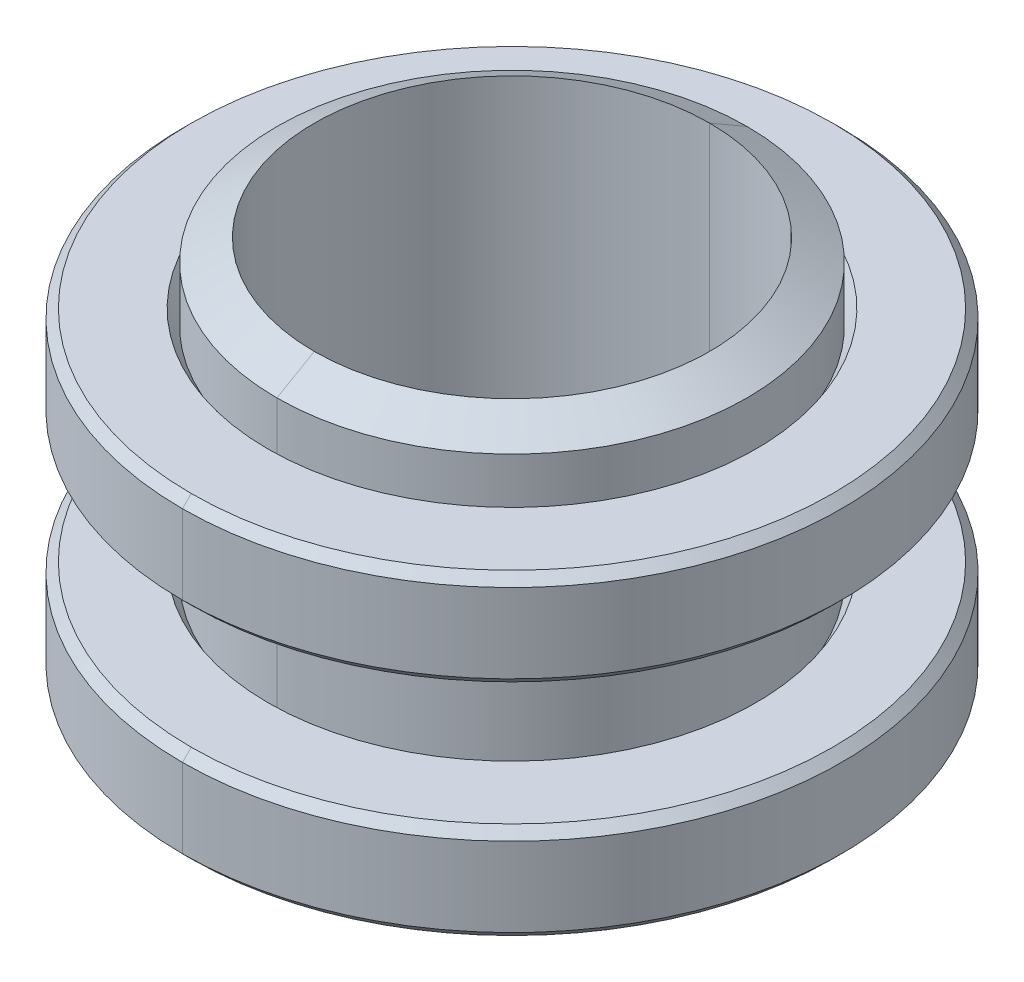
ISO-10303-21;
HEADER;
FILE_DESCRIPTION(('STEP AP214'),'2;1');
FILE_NAME('part.step','',(''),(''),'','','');
FILE_SCHEMA(('AUTOMOTIVE_DESIGN { 1 0 10303 214 1 1 1 1 }'));
ENDSEC;
DATA;
#1=APPLICATION_CONTEXT('core data for automotive mechanical design processes');
#2=APPLICATION_PROTOCOL_DEFINITION('international standard','automotive_design',2000,#1);
#3=PRODUCT_CONTEXT('',#1,'mechanical');
#4=PRODUCT('Part','Part','',(#3));
#5=PRODUCT_RELATED_PRODUCT_CATEGORY('part','',(#4));
#6=PRODUCT_DEFINITION_FORMATION('','',#4);
#7=PRODUCT_DEFINITION_CONTEXT('part definition',#1,'design');
#8=PRODUCT_DEFINITION('design','',#6,#7);
#9=PRODUCT_DEFINITION_SHAPE('','',#8);
#10=(LENGTH_UNIT() NAMED_UNIT(*) SI_UNIT(.MILLI.,.METRE.));
#11=(NAMED_UNIT(*) PLANE_ANGLE_UNIT() SI_UNIT($,.RADIAN.));
#12=(NAMED_UNIT(*) SI_UNIT($,.STERADIAN.) SOLID_ANGLE_UNIT());
#13=UNCERTAINTY_MEASURE_WITH_UNIT(LENGTH_MEASURE(1.E-05),#10,'distance_accuracy_value','');
#14=(GEOMETRIC_REPRESENTATION_CONTEXT(3) GLOBAL_UNCERTAINTY_ASSIGNED_CONTEXT((#13)) GLOBAL_UNIT_ASSIGNED_CONTEXT((#10,
#11,#12)) REPRESENTATION_CONTEXT('',''));
#15=CARTESIAN_POINT('',(0.,0.,0.));
#16=DIRECTION('',(0.,0.,1.));
#17=DIRECTION('',(1.,0.,0.));
#18=AXIS2_PLACEMENT_3D('',#15,#16,#17);
#19=CARTESIAN_POINT('',(0.,6.35,0.));
#20=DIRECTION('',(0.,1.,0.));
#21=DIRECTION('',(0.,0.,1.));
#22=AXIS2_PLACEMENT_3D('',#19,#20,#21);
#23=CYLINDRICAL_SURFACE('',#22,6.7945);
#24=DIRECTION('',(0.,1.,0.));
#25=VECTOR('',#24,1.);
#26=CARTESIAN_POINT('',(0.,6.35,-6.7945));
#27=LINE('',#26,#25);
#28=CARTESIAN_POINT('',(0.,-5.7267503844098,-6.7945));
#29=VERTEX_POINT('',#28);
#30=CARTESIAN_POINT('',(0.,5.7267503844098,-6.7945));
#31=VERTEX_POINT('',#30);
#32=EDGE_CURVE('P0_E81',#29,#31,#27,.T.);
#33=ORIENTED_EDGE('',*,*,#32,.F.);
#34=CARTESIAN_POINT('',(0.,-5.7267503844098,0.));
#35=DIRECTION('',(0.,1.,0.));
#36=DIRECTION('',(0.,0.,1.));
#37=AXIS2_PLACEMENT_3D('',#34,#35,#36);
#38=CIRCLE('',#37,6.7945);
#39=CARTESIAN_POINT('',(0.,-5.7267503844098,6.7945));
#40=VERTEX_POINT('',#39);
#41=EDGE_CURVE('P0_E11',#29,#40,#38,.T.);
#42=ORIENTED_EDGE('',*,*,#41,.T.);
#43=DIRECTION('',(0.,1.,0.));
#44=VECTOR('',#43,1.);
#45=CARTESIAN_POINT('',(0.,6.35,6.7945));
#46=LINE('',#45,#44);
#47=CARTESIAN_POINT('',(0.,5.7267503844098,6.7945));
#48=VERTEX_POINT('',#47);
#49=EDGE_CURVE('P0_E78',#40,#48,#46,.T.);
#50=ORIENTED_EDGE('',*,*,#49,.T.);
#51=CARTESIAN_POINT('',(0.,5.7267503844098,0.));
#52=DIRECTION('',(0.,1.,0.));
#53=DIRECTION('',(0.,0.,1.));
#54=AXIS2_PLACEMENT_3D('',#51,#52,#53);
#55=CIRCLE('',#54,6.7945);
#56=EDGE_CURVE('P0_E25',#31,#48,#55,.T.);
#57=ORIENTED_EDGE('',*,*,#56,.F.);
#58=EDGE_LOOP('',(#33,#42,#50,#57));
#59=FACE_BOUND('',#58,.T.);
#60=ADVANCED_FACE('P0_F17',(#59),#23,.T.);
#61=CARTESIAN_POINT('',(0.,-6.35,0.));
#62=DIRECTION('',(0.,1.,0.));
#63=DIRECTION('',(0.,0.,1.));
#64=AXIS2_PLACEMENT_3D('',#61,#62,#63);
#65=CONICAL_SURFACE('',#64,5.715,1.0471975511966);
#66=DIRECTION('',(0.,0.5,-0.86602540378444));
#67=VECTOR('',#66,1.);
#68=CARTESIAN_POINT('',(0.,-6.35,-5.715));
#69=LINE('',#68,#67);
#70=CARTESIAN_POINT('',(0.,-6.35,-5.715));
#71=VERTEX_POINT('',#70);
#72=EDGE_CURVE('P0_E97',#71,#29,#69,.T.);
#73=ORIENTED_EDGE('',*,*,#72,.F.);
#74=CARTESIAN_POINT('',(0.,-6.35,0.));
#75=DIRECTION('',(0.,1.,0.));
#76=DIRECTION('',(0.,0.,1.));
#77=AXIS2_PLACEMENT_3D('',#74,#75,#76);
#78=CIRCLE('',#77,5.715);
#79=CARTESIAN_POINT('',(0.,-6.35,5.715));
#80=VERTEX_POINT('',#79);
#81=EDGE_CURVE('P0_E91',#71,#80,#78,.T.);
#82=ORIENTED_EDGE('',*,*,#81,.T.);
#83=DIRECTION('',(0.,0.5,0.86602540378444));
#84=VECTOR('',#83,1.);
#85=CARTESIAN_POINT('',(0.,-6.35,5.715));
#86=LINE('',#85,#84);
#87=EDGE_CURVE('P0_E88',#80,#40,#86,.T.);
#88=ORIENTED_EDGE('',*,*,#87,.T.);
#89=ORIENTED_EDGE('',*,*,#41,.F.);
#90=EDGE_LOOP('',(#73,#82,#88,#89));
#91=FACE_BOUND('',#90,.T.);
#92=ADVANCED_FACE('P0_F89',(#91),#65,.T.);
#93=CARTESIAN_POINT('',(0.,6.35,0.));
#94=DIRECTION('',(0.,1.,0.));
#95=DIRECTION('',(0.,0.,1.));
#96=AXIS2_PLACEMENT_3D('',#93,#94,#95);
#97=CYLINDRICAL_SURFACE('',#96,5.715);
#98=DIRECTION('',(0.,1.,0.));
#99=VECTOR('',#98,1.);
#100=CARTESIAN_POINT('',(0.,6.35,-5.715));
#101=LINE('',#100,#99);
#102=CARTESIAN_POINT('',(0.,6.35,-5.715));
#103=VERTEX_POINT('',#102);
#104=EDGE_CURVE('P0_E128',#71,#103,#101,.T.);
#105=ORIENTED_EDGE('',*,*,#104,.F.);
#106=CARTESIAN_POINT('',(0.,-6.35,0.));
#107=DIRECTION('',(0.,1.,0.));
#108=DIRECTION('',(0.,0.,1.));
#109=AXIS2_PLACEMENT_3D('',#106,#107,#108);
#110=CIRCLE('',#109,5.715);
#111=EDGE_CURVE('P0_E104',#80,#71,#110,.T.);
#112=ORIENTED_EDGE('',*,*,#111,.F.);
#113=DIRECTION('',(0.,1.,0.));
#114=VECTOR('',#113,1.);
#115=CARTESIAN_POINT('',(0.,6.35,5.715));
#116=LINE('',#115,#114);
#117=CARTESIAN_POINT('',(0.,6.35,5.715));
#118=VERTEX_POINT('',#117);
#119=EDGE_CURVE('P0_E120',#80,#118,#116,.T.);
#120=ORIENTED_EDGE('',*,*,#119,.T.);
#121=CARTESIAN_POINT('',(0.,6.35,0.));
#122=DIRECTION('',(0.,1.,0.));
#123=DIRECTION('',(0.,0.,1.));
#124=AXIS2_PLACEMENT_3D('',#121,#122,#123);
#125=CIRCLE('',#124,5.715);
#126=EDGE_CURVE('P0_E118',#118,#103,#125,.T.);
#127=ORIENTED_EDGE('',*,*,#126,.T.);
#128=EDGE_LOOP('',(#105,#112,#120,#127));
#129=FACE_BOUND('',#128,.T.);
#130=ADVANCED_FACE('P0_F146',(#129),#97,.F.);
#131=CARTESIAN_POINT('',(0.,5.7267503844098,0.));
#132=DIRECTION('',(0.,-1.,0.));
#133=DIRECTION('',(0.,0.,-1.));
#134=AXIS2_PLACEMENT_3D('',#131,#132,#133);
#135=CONICAL_SURFACE('',#134,6.7945,1.0471975511966);
#136=DIRECTION('',(0.,-0.5,0.86602540378444));
#137=VECTOR('',#136,1.);
#138=CARTESIAN_POINT('',(0.,5.7267503844098,6.7945));
#139=LINE('',#138,#137);
#140=EDGE_CURVE('P0_E38',#118,#48,#139,.T.);
#141=ORIENTED_EDGE('',*,*,#140,.F.);
#142=CARTESIAN_POINT('',(0.,6.35,0.));
#143=DIRECTION('',(0.,1.,0.));
#144=DIRECTION('',(0.,0.,1.));
#145=AXIS2_PLACEMENT_3D('',#142,#143,#144);
#146=CIRCLE('',#145,5.715);
#147=EDGE_CURVE('P0_E124',#103,#118,#146,.T.);
#148=ORIENTED_EDGE('',*,*,#147,.F.);
#149=DIRECTION('',(0.,-0.5,-0.86602540378444));
#150=VECTOR('',#149,1.);
#151=CARTESIAN_POINT('',(0.,5.7267503844098,-6.7945));
#152=LINE('',#151,#150);
#153=EDGE_CURVE('P0_E48',#103,#31,#152,.T.);
#154=ORIENTED_EDGE('',*,*,#153,.T.);
#155=ORIENTED_EDGE('',*,*,#56,.T.);
#156=EDGE_LOOP('',(#141,#148,#154,#155));
#157=FACE_BOUND('',#156,.T.);
#158=ADVANCED_FACE('P0_F143',(#157),#135,.T.);
#159=CARTESIAN_POINT('',(0.,5.7267503844098,0.));
#160=DIRECTION('',(0.,-1.,0.));
#161=DIRECTION('',(0.,0.,-1.));
#162=AXIS2_PLACEMENT_3D('',#159,#160,#161);
#163=CONICAL_SURFACE('',#162,6.7945,1.0471975511966);
#164=ORIENTED_EDGE('',*,*,#126,.F.);
#165=ORIENTED_EDGE('',*,*,#140,.T.);
#166=CARTESIAN_POINT('',(0.,5.7267503844098,0.));
#167=DIRECTION('',(0.,1.,0.));
#168=DIRECTION('',(0.,0.,1.));
#169=AXIS2_PLACEMENT_3D('',#166,#167,#168);
#170=CIRCLE('',#169,6.7945);
#171=EDGE_CURVE('P0_E102',#48,#31,#170,.T.);
#172=ORIENTED_EDGE('',*,*,#171,.T.);
#173=ORIENTED_EDGE('',*,*,#153,.F.);
#174=EDGE_LOOP('',(#164,#165,#172,#173));
#175=FACE_BOUND('',#174,.T.);
#176=ADVANCED_FACE('P0_F144',(#175),#163,.T.);
#177=CARTESIAN_POINT('',(0.,6.35,0.));
#178=DIRECTION('',(0.,1.,0.));
#179=DIRECTION('',(0.,0.,1.));
#180=AXIS2_PLACEMENT_3D('',#177,#178,#179);
#181=CYLINDRICAL_SURFACE('',#180,5.715);
#182=ORIENTED_EDGE('',*,*,#81,.F.);
#183=ORIENTED_EDGE('',*,*,#104,.T.);
#184=ORIENTED_EDGE('',*,*,#147,.T.);
#185=ORIENTED_EDGE('',*,*,#119,.F.);
#186=EDGE_LOOP('',(#182,#183,#184,#185));
#187=FACE_BOUND('',#186,.T.);
#188=ADVANCED_FACE('P0_F148',(#187),#181,.F.);
#189=CARTESIAN_POINT('',(0.,-6.35,0.));
#190=DIRECTION('',(0.,1.,0.));
#191=DIRECTION('',(0.,0.,1.));
#192=AXIS2_PLACEMENT_3D('',#189,#190,#191);
#193=CONICAL_SURFACE('',#192,5.715,1.0471975511966);
#194=ORIENTED_EDGE('',*,*,#111,.T.);
#195=ORIENTED_EDGE('',*,*,#72,.T.);
#196=CARTESIAN_POINT('',(0.,-5.7267503844098,0.));
#197=DIRECTION('',(0.,1.,0.));
#198=DIRECTION('',(0.,0.,1.));
#199=AXIS2_PLACEMENT_3D('',#196,#197,#198);
#200=CIRCLE('',#199,6.7945);
#201=EDGE_CURVE('P0_E101',#40,#29,#200,.T.);
#202=ORIENTED_EDGE('',*,*,#201,.F.);
#203=ORIENTED_EDGE('',*,*,#87,.F.);
#204=EDGE_LOOP('',(#194,#195,#202,#203));
#205=FACE_BOUND('',#204,.T.);
#206=ADVANCED_FACE('P0_F106',(#205),#193,.T.);
#207=CARTESIAN_POINT('',(0.,6.35,0.));
#208=DIRECTION('',(0.,1.,0.));
#209=DIRECTION('',(0.,0.,1.));
#210=AXIS2_PLACEMENT_3D('',#207,#208,#209);
#211=CYLINDRICAL_SURFACE('',#210,6.7945);
#212=ORIENTED_EDGE('',*,*,#201,.T.);
#213=ORIENTED_EDGE('',*,*,#32,.T.);
#214=ORIENTED_EDGE('',*,*,#171,.F.);
#215=ORIENTED_EDGE('',*,*,#49,.F.);
#216=EDGE_LOOP('',(#212,#213,#214,#215));
#217=FACE_BOUND('',#216,.T.);
#218=ADVANCED_FACE('P0_F100',(#217),#211,.T.);
#219=CLOSED_SHELL('',(#60,#92,#130,#158,#176,#188,#206,#218));
#220=MANIFOLD_SOLID_BREP('P0_B1',#219);
#221=CARTESIAN_POINT('',(0.,-2.21794090512249,0.));
#222=DIRECTION('',(0.,1.,0.));
#223=DIRECTION('',(0.,0.,-1.));
#224=AXIS2_PLACEMENT_3D('',#221,#222,#223);
#225=CONICAL_SURFACE('',#224,6.7945,0.523598775598298);
#226=DIRECTION('',(0.,0.86602540378444,0.5));
#227=VECTOR('',#226,1.);
#228=CARTESIAN_POINT('',(0.,-2.21794090512249,6.7945));
#229=LINE('',#228,#227);
#230=CARTESIAN_POINT('',(0.,-2.21794090512249,6.7945));
#231=VERTEX_POINT('',#230);
#232=CARTESIAN_POINT('',(0.,-1.778,7.0485));
#233=VERTEX_POINT('',#232);
#234=EDGE_CURVE('P1_E206',#231,#233,#229,.T.);
#235=ORIENTED_EDGE('',*,*,#234,.F.);
#236=CARTESIAN_POINT('',(0.,-2.21794090512249,0.));
#237=DIRECTION('',(0.,1.,0.));
#238=DIRECTION('',(0.,0.,1.));
#239=AXIS2_PLACEMENT_3D('',#236,#237,#238);
#240=CIRCLE('',#239,6.7945);
#241=CARTESIAN_POINT('',(0.,-2.21794090512249,-6.7945));
#242=VERTEX_POINT('',#241);
#243=EDGE_CURVE('P1_E11',#242,#231,#240,.T.);
#244=ORIENTED_EDGE('',*,*,#243,.F.);
#245=DIRECTION('',(0.,0.86602540378444,-0.5));
#246=VECTOR('',#245,1.);
#247=CARTESIAN_POINT('',(0.,-2.21794090512249,-6.7945));
#248=LINE('',#247,#246);
#249=CARTESIAN_POINT('',(0.,-1.778,-7.0485));
#250=VERTEX_POINT('',#249);
#251=EDGE_CURVE('P1_E189',#242,#250,#248,.T.);
#252=ORIENTED_EDGE('',*,*,#251,.T.);
#253=CARTESIAN_POINT('',(0.,-1.778,0.));
#254=DIRECTION('',(0.,-1.,0.));
#255=DIRECTION('',(0.,0.,1.));
#256=AXIS2_PLACEMENT_3D('',#253,#254,#255);
#257=CIRCLE('',#256,7.0485);
#258=EDGE_CURVE('P1_E172',#233,#250,#257,.T.);
#259=ORIENTED_EDGE('',*,*,#258,.F.);
#260=EDGE_LOOP('',(#235,#244,#252,#259));
#261=FACE_BOUND('',#260,.T.);
#262=ADVANCED_FACE('P1_F17',(#261),#225,.F.);
#263=CARTESIAN_POINT('',(0.,-4.572,0.));
#264=DIRECTION('',(0.,-1.,0.));
#265=DIRECTION('',(0.,0.,1.));
#266=AXIS2_PLACEMENT_3D('',#263,#264,#265);
#267=CONICAL_SURFACE('',#266,7.0485,0.5235987755983);
#268=DIRECTION('',(0.,-0.866025403784437,-0.5));
#269=VECTOR('',#268,1.);
#270=CARTESIAN_POINT('',(0.,-4.572,-7.0485));
#271=LINE('',#270,#269);
#272=CARTESIAN_POINT('',(0.,-4.1320590948775,-6.7945));
#273=VERTEX_POINT('',#272);
#274=CARTESIAN_POINT('',(0.,-4.572,-7.0485));
#275=VERTEX_POINT('',#274);
#276=EDGE_CURVE('P1_E124',#273,#275,#271,.T.);
#277=ORIENTED_EDGE('',*,*,#276,.F.);
#278=CARTESIAN_POINT('',(0.,-4.1320590948775,0.));
#279=DIRECTION('',(0.,-1.,0.));
#280=DIRECTION('',(0.,0.,-1.));
#281=AXIS2_PLACEMENT_3D('',#278,#279,#280);
#282=CIRCLE('',#281,6.7945);
#283=CARTESIAN_POINT('',(0.,-4.1320590948775,6.7945));
#284=VERTEX_POINT('',#283);
#285=EDGE_CURVE('P1_E27',#284,#273,#282,.T.);
#286=ORIENTED_EDGE('',*,*,#285,.F.);
#287=DIRECTION('',(0.,-0.866025403784437,0.5));
#288=VECTOR('',#287,1.);
#289=CARTESIAN_POINT('',(0.,-4.572,7.0485));
#290=LINE('',#289,#288);
#291=CARTESIAN_POINT('',(0.,-4.572,7.0485));
#292=VERTEX_POINT('',#291);
#293=EDGE_CURVE('P1_E113',#284,#292,#290,.T.);
#294=ORIENTED_EDGE('',*,*,#293,.T.);
#295=CARTESIAN_POINT('',(0.,-4.572,0.));
#296=DIRECTION('',(0.,1.,0.));
#297=DIRECTION('',(0.,0.,-1.));
#298=AXIS2_PLACEMENT_3D('',#295,#296,#297);
#299=CIRCLE('',#298,7.0485);
#300=EDGE_CURVE('P1_E101',#275,#292,#299,.T.);
#301=ORIENTED_EDGE('',*,*,#300,.F.);
#302=EDGE_LOOP('',(#277,#286,#294,#301));
#303=FACE_BOUND('',#302,.T.);
#304=ADVANCED_FACE('P1_F114',(#303),#267,.F.);
#305=CARTESIAN_POINT('',(0.,-1.778,0.));
#306=DIRECTION('',(0.,-1.,0.));
#307=DIRECTION('',(0.,0.,1.));
#308=AXIS2_PLACEMENT_3D('',#305,#306,#307);
#309=CONICAL_SURFACE('',#308,9.271,0.785398163397442);
#310=DIRECTION('',(0.,-0.707106781186552,-0.707106781186543));
#311=VECTOR('',#310,1.);
#312=CARTESIAN_POINT('',(0.,-1.778,-9.271));
#313=LINE('',#312,#311);
#314=CARTESIAN_POINT('',(0.,-1.778,-9.271));
#315=VERTEX_POINT('',#314);
#316=CARTESIAN_POINT('',(0.,-2.032,-9.525));
#317=VERTEX_POINT('',#316);
#318=EDGE_CURVE('P1_E144',#315,#317,#313,.T.);
#319=ORIENTED_EDGE('',*,*,#318,.F.);
#320=CARTESIAN_POINT('',(0.,-1.778,0.));
#321=DIRECTION('',(0.,1.,0.));
#322=DIRECTION('',(0.,0.,1.));
#323=AXIS2_PLACEMENT_3D('',#320,#321,#322);
#324=CIRCLE('',#323,9.271);
#325=CARTESIAN_POINT('',(0.,-1.778,9.271));
#326=VERTEX_POINT('',#325);
#327=EDGE_CURVE('P1_E169',#326,#315,#324,.T.);
#328=ORIENTED_EDGE('',*,*,#327,.F.);
#329=DIRECTION('',(0.,-0.707106781186552,0.707106781186543));
#330=VECTOR('',#329,1.);
#331=CARTESIAN_POINT('',(0.,-1.778,9.271));
#332=LINE('',#331,#330);
#333=CARTESIAN_POINT('',(0.,-2.032,9.525));
#334=VERTEX_POINT('',#333);
#335=EDGE_CURVE('P1_E149',#326,#334,#332,.T.);
#336=ORIENTED_EDGE('',*,*,#335,.T.);
#337=CARTESIAN_POINT('',(0.,-2.032,0.));
#338=DIRECTION('',(0.,-1.,0.));
#339=DIRECTION('',(0.,0.,1.));
#340=AXIS2_PLACEMENT_3D('',#337,#338,#339);
#341=CIRCLE('',#340,9.525);
#342=EDGE_CURVE('P1_E66',#317,#334,#341,.T.);
#343=ORIENTED_EDGE('',*,*,#342,.F.);
#344=EDGE_LOOP('',(#319,#328,#336,#343));
#345=FACE_BOUND('',#344,.T.);
#346=ADVANCED_FACE('P1_F19',(#345),#309,.T.);
#347=CARTESIAN_POINT('',(0.,-4.318,0.));
#348=DIRECTION('',(0.,1.,0.));
#349=DIRECTION('',(0.,0.,-1.));
#350=AXIS2_PLACEMENT_3D('',#347,#348,#349);
#351=CONICAL_SURFACE('',#350,9.525,0.785398163397448);
#352=DIRECTION('',(0.,0.707106781186548,0.707106781186548));
#353=VECTOR('',#352,1.);
#354=CARTESIAN_POINT('',(0.,-4.318,9.525));
#355=LINE('',#354,#353);
#356=CARTESIAN_POINT('',(0.,-4.572,9.271));
#357=VERTEX_POINT('',#356);
#358=CARTESIAN_POINT('',(0.,-4.318,9.525));
#359=VERTEX_POINT('',#358);
#360=EDGE_CURVE('P1_E211',#357,#359,#355,.T.);
#361=ORIENTED_EDGE('',*,*,#360,.F.);
#362=CARTESIAN_POINT('',(0.,-4.572,0.));
#363=DIRECTION('',(0.,-1.,0.));
#364=DIRECTION('',(0.,0.,-1.));
#365=AXIS2_PLACEMENT_3D('',#362,#363,#364);
#366=CIRCLE('',#365,9.271);
#367=CARTESIAN_POINT('',(0.,-4.572,-9.271));
#368=VERTEX_POINT('',#367);
#369=EDGE_CURVE('P1_E75',#368,#357,#366,.T.);
#370=ORIENTED_EDGE('',*,*,#369,.F.);
#371=DIRECTION('',(0.,0.707106781186548,-0.707106781186548));
#372=VECTOR('',#371,1.);
#373=CARTESIAN_POINT('',(0.,-4.318,-9.525));
#374=LINE('',#373,#372);
#375=CARTESIAN_POINT('',(0.,-4.318,-9.525));
#376=VERTEX_POINT('',#375);
#377=EDGE_CURVE('P1_E137',#368,#376,#374,.T.);
#378=ORIENTED_EDGE('',*,*,#377,.T.);
#379=CARTESIAN_POINT('',(0.,-4.318,0.));
#380=DIRECTION('',(0.,1.,0.));
#381=DIRECTION('',(0.,0.,-1.));
#382=AXIS2_PLACEMENT_3D('',#379,#380,#381);
#383=CIRCLE('',#382,9.525);
#384=EDGE_CURVE('P1_E41',#359,#376,#383,.T.);
#385=ORIENTED_EDGE('',*,*,#384,.F.);
#386=EDGE_LOOP('',(#361,#370,#378,#385));
#387=FACE_BOUND('',#386,.T.);
#388=ADVANCED_FACE('P1_F285',(#387),#351,.T.);
#389=CARTESIAN_POINT('',(0.,-1.778,0.));
#390=DIRECTION('',(0.,1.,0.));
#391=DIRECTION('',(0.,0.,-1.));
#392=AXIS2_PLACEMENT_3D('',#389,#390,#391);
#393=CYLINDRICAL_SURFACE('',#392,6.7945);
#394=DIRECTION('',(0.,1.,0.));
#395=VECTOR('',#394,1.);
#396=CARTESIAN_POINT('',(0.,-1.778,6.7945));
#397=LINE('',#396,#395);
#398=EDGE_CURVE('P1_E139',#284,#231,#397,.T.);
#399=ORIENTED_EDGE('',*,*,#398,.F.);
#400=ORIENTED_EDGE('',*,*,#285,.T.);
#401=DIRECTION('',(0.,1.,0.));
#402=VECTOR('',#401,1.);
#403=CARTESIAN_POINT('',(0.,-1.778,-6.7945));
#404=LINE('',#403,#402);
#405=EDGE_CURVE('P1_E153',#273,#242,#404,.T.);
#406=ORIENTED_EDGE('',*,*,#405,.T.);
#407=ORIENTED_EDGE('',*,*,#243,.T.);
#408=EDGE_LOOP('',(#399,#400,#406,#407));
#409=FACE_BOUND('',#408,.T.);
#410=ADVANCED_FACE('P1_F180',(#409),#393,.F.);
#411=CARTESIAN_POINT('',(-9.525,-1.778,0.));
#412=DIRECTION('',(0.,-1.,0.));
#413=DIRECTION('',(0.,0.,-1.));
#414=AXIS2_PLACEMENT_3D('',#411,#412,#413);
#415=PLANE('',#414);
#416=CARTESIAN_POINT('',(0.,-1.778,0.));
#417=DIRECTION('',(0.,-1.,0.));
#418=DIRECTION('',(0.,0.,1.));
#419=AXIS2_PLACEMENT_3D('',#416,#417,#418);
#420=CIRCLE('',#419,7.0485);
#421=EDGE_CURVE('P1_E195',#250,#233,#420,.T.);
#422=ORIENTED_EDGE('',*,*,#421,.T.);
#423=ORIENTED_EDGE('',*,*,#258,.T.);
#424=EDGE_LOOP('',(#422,#423));
#425=FACE_BOUND('',#424,.T.);
#426=ORIENTED_EDGE('',*,*,#327,.T.);
#427=CARTESIAN_POINT('',(0.,-1.778,0.));
#428=DIRECTION('',(0.,1.,0.));
#429=DIRECTION('',(0.,0.,1.));
#430=AXIS2_PLACEMENT_3D('',#427,#428,#429);
#431=CIRCLE('',#430,9.271);
#432=EDGE_CURVE('P1_E121',#315,#326,#431,.T.);
#433=ORIENTED_EDGE('',*,*,#432,.T.);
#434=EDGE_LOOP('',(#426,#433));
#435=FACE_BOUND('',#434,.T.);
#436=ADVANCED_FACE('P1_F232',(#425,#435),#415,.F.);
#437=CARTESIAN_POINT('',(0.,-1.778,0.));
#438=DIRECTION('',(0.,1.,0.));
#439=DIRECTION('',(0.,0.,-1.));
#440=AXIS2_PLACEMENT_3D('',#437,#438,#439);
#441=CYLINDRICAL_SURFACE('',#440,9.525);
#442=DIRECTION('',(0.,1.,0.));
#443=VECTOR('',#442,1.);
#444=CARTESIAN_POINT('',(0.,-1.778,9.525));
#445=LINE('',#444,#443);
#446=EDGE_CURVE('P1_E157',#359,#334,#445,.T.);
#447=ORIENTED_EDGE('',*,*,#446,.F.);
#448=ORIENTED_EDGE('',*,*,#384,.T.);
#449=DIRECTION('',(0.,1.,0.));
#450=VECTOR('',#449,1.);
#451=CARTESIAN_POINT('',(0.,-1.778,-9.525));
#452=LINE('',#451,#450);
#453=EDGE_CURVE('P1_E160',#376,#317,#452,.T.);
#454=ORIENTED_EDGE('',*,*,#453,.T.);
#455=ORIENTED_EDGE('',*,*,#342,.T.);
#456=EDGE_LOOP('',(#447,#448,#454,#455));
#457=FACE_BOUND('',#456,.T.);
#458=ADVANCED_FACE('P1_F230',(#457),#441,.T.);
#459=CARTESIAN_POINT('',(-6.7945,-4.572,0.));
#460=DIRECTION('',(0.,1.,0.));
#461=DIRECTION('',(0.,0.,-1.));
#462=AXIS2_PLACEMENT_3D('',#459,#460,#461);
#463=PLANE('',#462);
#464=CARTESIAN_POINT('',(0.,-4.572,0.));
#465=DIRECTION('',(0.,1.,0.));
#466=DIRECTION('',(0.,0.,-1.));
#467=AXIS2_PLACEMENT_3D('',#464,#465,#466);
#468=CIRCLE('',#467,7.0485);
#469=EDGE_CURVE('P1_E108',#292,#275,#468,.T.);
#470=ORIENTED_EDGE('',*,*,#469,.T.);
#471=ORIENTED_EDGE('',*,*,#300,.T.);
#472=EDGE_LOOP('',(#470,#471));
#473=FACE_BOUND('',#472,.T.);
#474=ORIENTED_EDGE('',*,*,#369,.T.);
#475=CARTESIAN_POINT('',(0.,-4.572,0.));
#476=DIRECTION('',(0.,-1.,0.));
#477=DIRECTION('',(0.,0.,-1.));
#478=AXIS2_PLACEMENT_3D('',#475,#476,#477);
#479=CIRCLE('',#478,9.271);
#480=EDGE_CURVE('P1_E210',#357,#368,#479,.T.);
#481=ORIENTED_EDGE('',*,*,#480,.T.);
#482=EDGE_LOOP('',(#474,#481));
#483=FACE_BOUND('',#482,.T.);
#484=ADVANCED_FACE('P1_F106',(#473,#483),#463,.F.);
#485=CARTESIAN_POINT('',(0.,-1.778,0.));
#486=DIRECTION('',(0.,1.,0.));
#487=DIRECTION('',(0.,0.,-1.));
#488=AXIS2_PLACEMENT_3D('',#485,#486,#487);
#489=CYLINDRICAL_SURFACE('',#488,9.525);
#490=CARTESIAN_POINT('',(0.,-4.318,0.));
#491=DIRECTION('',(0.,1.,0.));
#492=DIRECTION('',(0.,0.,-1.));
#493=AXIS2_PLACEMENT_3D('',#490,#491,#492);
#494=CIRCLE('',#493,9.525);
#495=EDGE_CURVE('P1_E140',#376,#359,#494,.T.);
#496=ORIENTED_EDGE('',*,*,#495,.T.);
#497=ORIENTED_EDGE('',*,*,#446,.T.);
#498=CARTESIAN_POINT('',(0.,-2.032,0.));
#499=DIRECTION('',(0.,-1.,0.));
#500=DIRECTION('',(0.,0.,1.));
#501=AXIS2_PLACEMENT_3D('',#498,#499,#500);
#502=CIRCLE('',#501,9.525);
#503=EDGE_CURVE('P1_E145',#334,#317,#502,.T.);
#504=ORIENTED_EDGE('',*,*,#503,.T.);
#505=ORIENTED_EDGE('',*,*,#453,.F.);
#506=EDGE_LOOP('',(#496,#497,#504,#505));
#507=FACE_BOUND('',#506,.T.);
#508=ADVANCED_FACE('P1_F227',(#507),#489,.T.);
#509=CARTESIAN_POINT('',(0.,-1.778,0.));
#510=DIRECTION('',(0.,1.,0.));
#511=DIRECTION('',(0.,0.,-1.));
#512=AXIS2_PLACEMENT_3D('',#509,#510,#511);
#513=CYLINDRICAL_SURFACE('',#512,6.7945);
#514=CARTESIAN_POINT('',(0.,-4.1320590948775,0.));
#515=DIRECTION('',(0.,-1.,0.));
#516=DIRECTION('',(0.,0.,-1.));
#517=AXIS2_PLACEMENT_3D('',#514,#515,#516);
#518=CIRCLE('',#517,6.7945);
#519=EDGE_CURVE('P1_E132',#273,#284,#518,.T.);
#520=ORIENTED_EDGE('',*,*,#519,.T.);
#521=ORIENTED_EDGE('',*,*,#398,.T.);
#522=CARTESIAN_POINT('',(0.,-2.21794090512249,0.));
#523=DIRECTION('',(0.,1.,0.));
#524=DIRECTION('',(0.,0.,1.));
#525=AXIS2_PLACEMENT_3D('',#522,#523,#524);
#526=CIRCLE('',#525,6.7945);
#527=EDGE_CURVE('P1_E188',#231,#242,#526,.T.);
#528=ORIENTED_EDGE('',*,*,#527,.T.);
#529=ORIENTED_EDGE('',*,*,#405,.F.);
#530=EDGE_LOOP('',(#520,#521,#528,#529));
#531=FACE_BOUND('',#530,.T.);
#532=ADVANCED_FACE('P1_F186',(#531),#513,.F.);
#533=CARTESIAN_POINT('',(0.,-4.318,0.));
#534=DIRECTION('',(0.,1.,0.));
#535=DIRECTION('',(0.,0.,-1.));
#536=AXIS2_PLACEMENT_3D('',#533,#534,#535);
#537=CONICAL_SURFACE('',#536,9.525,0.785398163397448);
#538=ORIENTED_EDGE('',*,*,#480,.F.);
#539=ORIENTED_EDGE('',*,*,#360,.T.);
#540=ORIENTED_EDGE('',*,*,#495,.F.);
#541=ORIENTED_EDGE('',*,*,#377,.F.);
#542=EDGE_LOOP('',(#538,#539,#540,#541));
#543=FACE_BOUND('',#542,.T.);
#544=ADVANCED_FACE('P1_F255',(#543),#537,.T.);
#545=CARTESIAN_POINT('',(0.,-1.778,0.));
#546=DIRECTION('',(0.,-1.,0.));
#547=DIRECTION('',(0.,0.,1.));
#548=AXIS2_PLACEMENT_3D('',#545,#546,#547);
#549=CONICAL_SURFACE('',#548,9.271,0.785398163397442);
#550=ORIENTED_EDGE('',*,*,#432,.F.);
#551=ORIENTED_EDGE('',*,*,#318,.T.);
#552=ORIENTED_EDGE('',*,*,#503,.F.);
#553=ORIENTED_EDGE('',*,*,#335,.F.);
#554=EDGE_LOOP('',(#550,#551,#552,#553));
#555=FACE_BOUND('',#554,.T.);
#556=ADVANCED_FACE('P1_F225',(#555),#549,.T.);
#557=CARTESIAN_POINT('',(0.,-4.572,0.));
#558=DIRECTION('',(0.,-1.,0.));
#559=DIRECTION('',(0.,0.,1.));
#560=AXIS2_PLACEMENT_3D('',#557,#558,#559);
#561=CONICAL_SURFACE('',#560,7.0485,0.5235987755983);
#562=ORIENTED_EDGE('',*,*,#519,.F.);
#563=ORIENTED_EDGE('',*,*,#276,.T.);
#564=ORIENTED_EDGE('',*,*,#469,.F.);
#565=ORIENTED_EDGE('',*,*,#293,.F.);
#566=EDGE_LOOP('',(#562,#563,#564,#565));
#567=FACE_BOUND('',#566,.T.);
#568=ADVANCED_FACE('P1_F123',(#567),#561,.F.);
#569=CARTESIAN_POINT('',(0.,-2.21794090512249,0.));
#570=DIRECTION('',(0.,1.,0.));
#571=DIRECTION('',(0.,0.,-1.));
#572=AXIS2_PLACEMENT_3D('',#569,#570,#571);
#573=CONICAL_SURFACE('',#572,6.7945,0.523598775598298);
#574=ORIENTED_EDGE('',*,*,#527,.F.);
#575=ORIENTED_EDGE('',*,*,#234,.T.);
#576=ORIENTED_EDGE('',*,*,#421,.F.);
#577=ORIENTED_EDGE('',*,*,#251,.F.);
#578=EDGE_LOOP('',(#574,#575,#576,#577));
#579=FACE_BOUND('',#578,.T.);
#580=ADVANCED_FACE('P1_F263',(#579),#573,.F.);
#581=CLOSED_SHELL('',(#262,#304,#346,#388,#410,#436,#458,#484,#508,#532,#544,#556,#568,#580));
#582=MANIFOLD_SOLID_BREP('P1_B1',#581);
#583=CARTESIAN_POINT('',(0.,4.13205909487751,0.));
#584=DIRECTION('',(0.,1.,0.));
#585=DIRECTION('',(0.,0.,-1.));
#586=AXIS2_PLACEMENT_3D('',#583,#584,#585);
#587=CONICAL_SURFACE('',#586,6.7945,0.523598775598298);
#588=DIRECTION('',(0.,0.86602540378444,0.5));
#589=VECTOR('',#588,1.);
#590=CARTESIAN_POINT('',(0.,4.13205909487751,6.7945));
#591=LINE('',#590,#589);
#592=CARTESIAN_POINT('',(0.,4.13205909487751,6.7945));
#593=VERTEX_POINT('',#592);
#594=CARTESIAN_POINT('',(0.,4.572,7.0485));
#595=VERTEX_POINT('',#594);
#596=EDGE_CURVE('P2_E145',#593,#595,#591,.T.);
#597=ORIENTED_EDGE('',*,*,#596,.F.);
#598=CARTESIAN_POINT('',(0.,4.13205909487751,0.));
#599=DIRECTION('',(0.,1.,0.));
#600=DIRECTION('',(0.,0.,1.));
#601=AXIS2_PLACEMENT_3D('',#598,#599,#600);
#602=CIRCLE('',#601,6.7945);
#603=CARTESIAN_POINT('',(0.,4.13205909487751,-6.7945));
#604=VERTEX_POINT('',#603);
#605=EDGE_CURVE('P2_E10',#604,#593,#602,.T.);
#606=ORIENTED_EDGE('',*,*,#605,.F.);
#607=DIRECTION('',(0.,0.86602540378444,-0.5));
#608=VECTOR('',#607,1.);
#609=CARTESIAN_POINT('',(0.,4.13205909487751,-6.7945));
#610=LINE('',#609,#608);
#611=CARTESIAN_POINT('',(0.,4.572,-7.0485));
#612=VERTEX_POINT('',#611);
#613=EDGE_CURVE('P2_E154',#604,#612,#610,.T.);
#614=ORIENTED_EDGE('',*,*,#613,.T.);
#615=CARTESIAN_POINT('',(0.,4.572,0.));
#616=DIRECTION('',(0.,-1.,0.));
#617=DIRECTION('',(0.,0.,1.));
#618=AXIS2_PLACEMENT_3D('',#615,#616,#617);
#619=CIRCLE('',#618,7.0485);
#620=EDGE_CURVE('P2_E146',#595,#612,#619,.T.);
#621=ORIENTED_EDGE('',*,*,#620,.F.);
#622=EDGE_LOOP('',(#597,#606,#614,#621));
#623=FACE_BOUND('',#622,.T.);
#624=ADVANCED_FACE('P2_F16',(#623),#587,.F.);
#625=CARTESIAN_POINT('',(0.,1.778,0.));
#626=DIRECTION('',(0.,-1.,0.));
#627=DIRECTION('',(0.,0.,1.));
#628=AXIS2_PLACEMENT_3D('',#625,#626,#627);
#629=CONICAL_SURFACE('',#628,7.0485,0.5235987755983);
#630=DIRECTION('',(0.,-0.866025403784437,-0.5));
#631=VECTOR('',#630,1.);
#632=CARTESIAN_POINT('',(0.,1.778,-7.0485));
#633=LINE('',#632,#631);
#634=CARTESIAN_POINT('',(0.,2.2179409051225,-6.7945));
#635=VERTEX_POINT('',#634);
#636=CARTESIAN_POINT('',(0.,1.778,-7.0485));
#637=VERTEX_POINT('',#636);
#638=EDGE_CURVE('P2_E170',#635,#637,#633,.T.);
#639=ORIENTED_EDGE('',*,*,#638,.F.);
#640=CARTESIAN_POINT('',(0.,2.2179409051225,0.));
#641=DIRECTION('',(0.,-1.,0.));
#642=DIRECTION('',(0.,0.,-1.));
#643=AXIS2_PLACEMENT_3D('',#640,#641,#642);
#644=CIRCLE('',#643,6.7945);
#645=CARTESIAN_POINT('',(0.,2.2179409051225,6.7945));
#646=VERTEX_POINT('',#645);
#647=EDGE_CURVE('P2_E24',#646,#635,#644,.T.);
#648=ORIENTED_EDGE('',*,*,#647,.F.);
#649=DIRECTION('',(0.,-0.866025403784437,0.5));
#650=VECTOR('',#649,1.);
#651=CARTESIAN_POINT('',(0.,1.778,7.0485));
#652=LINE('',#651,#650);
#653=CARTESIAN_POINT('',(0.,1.778,7.0485));
#654=VERTEX_POINT('',#653);
#655=EDGE_CURVE('P2_E165',#646,#654,#652,.T.);
#656=ORIENTED_EDGE('',*,*,#655,.T.);
#657=CARTESIAN_POINT('',(0.,1.778,0.));
#658=DIRECTION('',(0.,1.,0.));
#659=DIRECTION('',(0.,0.,-1.));
#660=AXIS2_PLACEMENT_3D('',#657,#658,#659);
#661=CIRCLE('',#660,7.0485);
#662=EDGE_CURVE('P2_E86',#637,#654,#661,.T.);
#663=ORIENTED_EDGE('',*,*,#662,.F.);
#664=EDGE_LOOP('',(#639,#648,#656,#663));
#665=FACE_BOUND('',#664,.T.);
#666=ADVANCED_FACE('P2_F260',(#665),#629,.F.);
#667=CARTESIAN_POINT('',(0.,4.572,0.));
#668=DIRECTION('',(0.,-1.,0.));
#669=DIRECTION('',(0.,0.,1.));
#670=AXIS2_PLACEMENT_3D('',#667,#668,#669);
#671=CONICAL_SURFACE('',#670,9.271,0.785398163397442);
#672=DIRECTION('',(0.,-0.707106781186552,-0.707106781186543));
#673=VECTOR('',#672,1.);
#674=CARTESIAN_POINT('',(0.,4.572,-9.271));
#675=LINE('',#674,#673);
#676=CARTESIAN_POINT('',(0.,4.572,-9.271));
#677=VERTEX_POINT('',#676);
#678=CARTESIAN_POINT('',(0.,4.318,-9.525));
#679=VERTEX_POINT('',#678);
#680=EDGE_CURVE('P2_E182',#677,#679,#675,.T.);
#681=ORIENTED_EDGE('',*,*,#680,.F.);
#682=CARTESIAN_POINT('',(0.,4.572,0.));
#683=DIRECTION('',(0.,1.,0.));
#684=DIRECTION('',(0.,0.,1.));
#685=AXIS2_PLACEMENT_3D('',#682,#683,#684);
#686=CIRCLE('',#685,9.271);
#687=CARTESIAN_POINT('',(0.,4.572,9.271));
#688=VERTEX_POINT('',#687);
#689=EDGE_CURVE('P2_E189',#688,#677,#686,.T.);
#690=ORIENTED_EDGE('',*,*,#689,.F.);
#691=DIRECTION('',(0.,-0.707106781186552,0.707106781186543));
#692=VECTOR('',#691,1.);
#693=CARTESIAN_POINT('',(0.,4.572,9.271));
#694=LINE('',#693,#692);
#695=CARTESIAN_POINT('',(0.,4.318,9.525));
#696=VERTEX_POINT('',#695);
#697=EDGE_CURVE('P2_E178',#688,#696,#694,.T.);
#698=ORIENTED_EDGE('',*,*,#697,.T.);
#699=CARTESIAN_POINT('',(0.,4.318,0.));
#700=DIRECTION('',(0.,-1.,0.));
#701=DIRECTION('',(0.,0.,1.));
#702=AXIS2_PLACEMENT_3D('',#699,#700,#701);
#703=CIRCLE('',#702,9.525);
#704=EDGE_CURVE('P2_E61',#679,#696,#703,.T.);
#705=ORIENTED_EDGE('',*,*,#704,.F.);
#706=EDGE_LOOP('',(#681,#690,#698,#705));
#707=FACE_BOUND('',#706,.T.);
#708=ADVANCED_FACE('P2_F237',(#707),#671,.T.);
#709=CARTESIAN_POINT('',(0.,2.032,0.));
#710=DIRECTION('',(0.,1.,0.));
#711=DIRECTION('',(0.,0.,-1.));
#712=AXIS2_PLACEMENT_3D('',#709,#710,#711);
#713=CONICAL_SURFACE('',#712,9.525,0.785398163397448);
#714=DIRECTION('',(0.,0.707106781186548,0.707106781186548));
#715=VECTOR('',#714,1.);
#716=CARTESIAN_POINT('',(0.,2.032,9.525));
#717=LINE('',#716,#715);
#718=CARTESIAN_POINT('',(0.,1.778,9.271));
#719=VERTEX_POINT('',#718);
#720=CARTESIAN_POINT('',(0.,2.032,9.525));
#721=VERTEX_POINT('',#720);
#722=EDGE_CURVE('P2_E177',#719,#721,#717,.T.);
#723=ORIENTED_EDGE('',*,*,#722,.F.);
#724=CARTESIAN_POINT('',(0.,1.778,0.));
#725=DIRECTION('',(0.,-1.,0.));
#726=DIRECTION('',(0.,0.,-1.));
#727=AXIS2_PLACEMENT_3D('',#724,#725,#726);
#728=CIRCLE('',#727,9.271);
#729=CARTESIAN_POINT('',(0.,1.778,-9.271));
#730=VERTEX_POINT('',#729);
#731=EDGE_CURVE('P2_E212',#730,#719,#728,.T.);
#732=ORIENTED_EDGE('',*,*,#731,.F.);
#733=DIRECTION('',(0.,0.707106781186548,-0.707106781186548));
#734=VECTOR('',#733,1.);
#735=CARTESIAN_POINT('',(0.,2.032,-9.525));
#736=LINE('',#735,#734);
#737=CARTESIAN_POINT('',(0.,2.032,-9.525));
#738=VERTEX_POINT('',#737);
#739=EDGE_CURVE('P2_E142',#730,#738,#736,.T.);
#740=ORIENTED_EDGE('',*,*,#739,.T.);
#741=CARTESIAN_POINT('',(0.,2.032,0.));
#742=DIRECTION('',(0.,1.,0.));
#743=DIRECTION('',(0.,0.,-1.));
#744=AXIS2_PLACEMENT_3D('',#741,#742,#743);
#745=CIRCLE('',#744,9.525);
#746=EDGE_CURVE('P2_E37',#721,#738,#745,.T.);
#747=ORIENTED_EDGE('',*,*,#746,.F.);
#748=EDGE_LOOP('',(#723,#732,#740,#747));
#749=FACE_BOUND('',#748,.T.);
#750=ADVANCED_FACE('P2_F267',(#749),#713,.T.);
#751=CARTESIAN_POINT('',(0.,4.572,0.));
#752=DIRECTION('',(0.,1.,0.));
#753=DIRECTION('',(0.,0.,-1.));
#754=AXIS2_PLACEMENT_3D('',#751,#752,#753);
#755=CYLINDRICAL_SURFACE('',#754,6.7945);
#756=DIRECTION('',(0.,1.,0.));
#757=VECTOR('',#756,1.);
#758=CARTESIAN_POINT('',(0.,4.572,6.7945));
#759=LINE('',#758,#757);
#760=EDGE_CURVE('P2_E125',#646,#593,#759,.T.);
#761=ORIENTED_EDGE('',*,*,#760,.F.);
#762=ORIENTED_EDGE('',*,*,#647,.T.);
#763=DIRECTION('',(0.,1.,0.));
#764=VECTOR('',#763,1.);
#765=CARTESIAN_POINT('',(0.,4.572,-6.7945));
#766=LINE('',#765,#764);
#767=EDGE_CURVE('P2_E128',#635,#604,#766,.T.);
#768=ORIENTED_EDGE('',*,*,#767,.T.);
#769=ORIENTED_EDGE('',*,*,#605,.T.);
#770=EDGE_LOOP('',(#761,#762,#768,#769));
#771=FACE_BOUND('',#770,.T.);
#772=ADVANCED_FACE('P2_F124',(#771),#755,.F.);
#773=CARTESIAN_POINT('',(-9.525,4.572,0.));
#774=DIRECTION('',(0.,-1.,0.));
#775=DIRECTION('',(0.,0.,-1.));
#776=AXIS2_PLACEMENT_3D('',#773,#774,#775);
#777=PLANE('',#776);
#778=CARTESIAN_POINT('',(0.,4.572,0.));
#779=DIRECTION('',(0.,-1.,0.));
#780=DIRECTION('',(0.,0.,1.));
#781=AXIS2_PLACEMENT_3D('',#778,#779,#780);
#782=CIRCLE('',#781,7.0485);
#783=EDGE_CURVE('P2_E151',#612,#595,#782,.T.);
#784=ORIENTED_EDGE('',*,*,#783,.T.);
#785=ORIENTED_EDGE('',*,*,#620,.T.);
#786=EDGE_LOOP('',(#784,#785));
#787=FACE_BOUND('',#786,.T.);
#788=ORIENTED_EDGE('',*,*,#689,.T.);
#789=CARTESIAN_POINT('',(0.,4.572,0.));
#790=DIRECTION('',(0.,1.,0.));
#791=DIRECTION('',(0.,0.,1.));
#792=AXIS2_PLACEMENT_3D('',#789,#790,#791);
#793=CIRCLE('',#792,9.271);
#794=EDGE_CURVE('P2_E163',#677,#688,#793,.T.);
#795=ORIENTED_EDGE('',*,*,#794,.T.);
#796=EDGE_LOOP('',(#788,#795));
#797=FACE_BOUND('',#796,.T.);
#798=ADVANCED_FACE('P2_F226',(#787,#797),#777,.F.);
#799=CARTESIAN_POINT('',(0.,4.572,0.));
#800=DIRECTION('',(0.,1.,0.));
#801=DIRECTION('',(0.,0.,-1.));
#802=AXIS2_PLACEMENT_3D('',#799,#800,#801);
#803=CYLINDRICAL_SURFACE('',#802,9.525);
#804=DIRECTION('',(0.,1.,0.));
#805=VECTOR('',#804,1.);
#806=CARTESIAN_POINT('',(0.,4.572,9.525));
#807=LINE('',#806,#805);
#808=EDGE_CURVE('P2_E206',#721,#696,#807,.T.);
#809=ORIENTED_EDGE('',*,*,#808,.F.);
#810=ORIENTED_EDGE('',*,*,#746,.T.);
#811=DIRECTION('',(0.,1.,0.));
#812=VECTOR('',#811,1.);
#813=CARTESIAN_POINT('',(0.,4.572,-9.525));
#814=LINE('',#813,#812);
#815=EDGE_CURVE('P2_E209',#738,#679,#814,.T.);
#816=ORIENTED_EDGE('',*,*,#815,.T.);
#817=ORIENTED_EDGE('',*,*,#704,.T.);
#818=EDGE_LOOP('',(#809,#810,#816,#817));
#819=FACE_BOUND('',#818,.T.);
#820=ADVANCED_FACE('P2_F245',(#819),#803,.T.);
#821=CARTESIAN_POINT('',(-6.7945,1.778,0.));
#822=DIRECTION('',(0.,1.,0.));
#823=DIRECTION('',(1.,0.,0.));
#824=AXIS2_PLACEMENT_3D('',#821,#822,#823);
#825=PLANE('',#824);
#826=CARTESIAN_POINT('',(0.,1.778,0.));
#827=DIRECTION('',(0.,1.,0.));
#828=DIRECTION('',(0.,0.,-1.));
#829=AXIS2_PLACEMENT_3D('',#826,#827,#828);
#830=CIRCLE('',#829,7.0485);
#831=EDGE_CURVE('P2_E166',#654,#637,#830,.T.);
#832=ORIENTED_EDGE('',*,*,#831,.T.);
#833=ORIENTED_EDGE('',*,*,#662,.T.);
#834=EDGE_LOOP('',(#832,#833));
#835=FACE_BOUND('',#834,.T.);
#836=ORIENTED_EDGE('',*,*,#731,.T.);
#837=CARTESIAN_POINT('',(0.,1.778,0.));
#838=DIRECTION('',(0.,-1.,0.));
#839=DIRECTION('',(0.,0.,-1.));
#840=AXIS2_PLACEMENT_3D('',#837,#838,#839);
#841=CIRCLE('',#840,9.271);
#842=EDGE_CURVE('P2_E173',#719,#730,#841,.T.);
#843=ORIENTED_EDGE('',*,*,#842,.T.);
#844=EDGE_LOOP('',(#836,#843));
#845=FACE_BOUND('',#844,.T.);
#846=ADVANCED_FACE('P2_F247',(#835,#845),#825,.F.);
#847=CARTESIAN_POINT('',(0.,4.572,0.));
#848=DIRECTION('',(0.,1.,0.));
#849=DIRECTION('',(0.,0.,-1.));
#850=AXIS2_PLACEMENT_3D('',#847,#848,#849);
#851=CYLINDRICAL_SURFACE('',#850,9.525);
#852=CARTESIAN_POINT('',(0.,2.032,0.));
#853=DIRECTION('',(0.,1.,0.));
#854=DIRECTION('',(0.,0.,-1.));
#855=AXIS2_PLACEMENT_3D('',#852,#853,#854);
#856=CIRCLE('',#855,9.525);
#857=EDGE_CURVE('P2_E198',#738,#721,#856,.T.);
#858=ORIENTED_EDGE('',*,*,#857,.T.);
#859=ORIENTED_EDGE('',*,*,#808,.T.);
#860=CARTESIAN_POINT('',(0.,4.318,0.));
#861=DIRECTION('',(0.,-1.,0.));
#862=DIRECTION('',(0.,0.,1.));
#863=AXIS2_PLACEMENT_3D('',#860,#861,#862);
#864=CIRCLE('',#863,9.525);
#865=EDGE_CURVE('P2_E186',#696,#679,#864,.T.);
#866=ORIENTED_EDGE('',*,*,#865,.T.);
#867=ORIENTED_EDGE('',*,*,#815,.F.);
#868=EDGE_LOOP('',(#858,#859,#866,#867));
#869=FACE_BOUND('',#868,.T.);
#870=ADVANCED_FACE('P2_F243',(#869),#851,.T.);
#871=CARTESIAN_POINT('',(0.,4.572,0.));
#872=DIRECTION('',(0.,1.,0.));
#873=DIRECTION('',(0.,0.,-1.));
#874=AXIS2_PLACEMENT_3D('',#871,#872,#873);
#875=CYLINDRICAL_SURFACE('',#874,6.7945);
#876=CARTESIAN_POINT('',(0.,2.2179409051225,0.));
#877=DIRECTION('',(0.,-1.,0.));
#878=DIRECTION('',(0.,0.,-1.));
#879=AXIS2_PLACEMENT_3D('',#876,#877,#878);
#880=CIRCLE('',#879,6.7945);
#881=EDGE_CURVE('P2_E140',#635,#646,#880,.T.);
#882=ORIENTED_EDGE('',*,*,#881,.T.);
#883=ORIENTED_EDGE('',*,*,#760,.T.);
#884=CARTESIAN_POINT('',(0.,4.13205909487751,0.));
#885=DIRECTION('',(0.,1.,0.));
#886=DIRECTION('',(0.,0.,1.));
#887=AXIS2_PLACEMENT_3D('',#884,#885,#886);
#888=CIRCLE('',#887,6.7945);
#889=EDGE_CURVE('P2_E138',#593,#604,#888,.T.);
#890=ORIENTED_EDGE('',*,*,#889,.T.);
#891=ORIENTED_EDGE('',*,*,#767,.F.);
#892=EDGE_LOOP('',(#882,#883,#890,#891));
#893=FACE_BOUND('',#892,.T.);
#894=ADVANCED_FACE('P2_F136',(#893),#875,.F.);
#895=CARTESIAN_POINT('',(0.,2.032,0.));
#896=DIRECTION('',(0.,1.,0.));
#897=DIRECTION('',(0.,0.,-1.));
#898=AXIS2_PLACEMENT_3D('',#895,#896,#897);
#899=CONICAL_SURFACE('',#898,9.525,0.785398163397448);
#900=ORIENTED_EDGE('',*,*,#842,.F.);
#901=ORIENTED_EDGE('',*,*,#722,.T.);
#902=ORIENTED_EDGE('',*,*,#857,.F.);
#903=ORIENTED_EDGE('',*,*,#739,.F.);
#904=EDGE_LOOP('',(#900,#901,#902,#903));
#905=FACE_BOUND('',#904,.T.);
#906=ADVANCED_FACE('P2_F276',(#905),#899,.T.);
#907=CARTESIAN_POINT('',(0.,4.572,0.));
#908=DIRECTION('',(0.,-1.,0.));
#909=DIRECTION('',(0.,0.,1.));
#910=AXIS2_PLACEMENT_3D('',#907,#908,#909);
#911=CONICAL_SURFACE('',#910,9.271,0.785398163397442);
#912=ORIENTED_EDGE('',*,*,#794,.F.);
#913=ORIENTED_EDGE('',*,*,#680,.T.);
#914=ORIENTED_EDGE('',*,*,#865,.F.);
#915=ORIENTED_EDGE('',*,*,#697,.F.);
#916=EDGE_LOOP('',(#912,#913,#914,#915));
#917=FACE_BOUND('',#916,.T.);
#918=ADVANCED_FACE('P2_F241',(#917),#911,.T.);
#919=CARTESIAN_POINT('',(0.,1.778,0.));
#920=DIRECTION('',(0.,-1.,0.));
#921=DIRECTION('',(0.,0.,1.));
#922=AXIS2_PLACEMENT_3D('',#919,#920,#921);
#923=CONICAL_SURFACE('',#922,7.0485,0.5235987755983);
#924=ORIENTED_EDGE('',*,*,#881,.F.);
#925=ORIENTED_EDGE('',*,*,#638,.T.);
#926=ORIENTED_EDGE('',*,*,#831,.F.);
#927=ORIENTED_EDGE('',*,*,#655,.F.);
#928=EDGE_LOOP('',(#924,#925,#926,#927));
#929=FACE_BOUND('',#928,.T.);
#930=ADVANCED_FACE('P2_F286',(#929),#923,.F.);
#931=CARTESIAN_POINT('',(0.,4.13205909487751,0.));
#932=DIRECTION('',(0.,1.,0.));
#933=DIRECTION('',(0.,0.,-1.));
#934=AXIS2_PLACEMENT_3D('',#931,#932,#933);
#935=CONICAL_SURFACE('',#934,6.7945,0.523598775598298);
#936=ORIENTED_EDGE('',*,*,#889,.F.);
#937=ORIENTED_EDGE('',*,*,#596,.T.);
#938=ORIENTED_EDGE('',*,*,#783,.F.);
#939=ORIENTED_EDGE('',*,*,#613,.F.);
#940=EDGE_LOOP('',(#936,#937,#938,#939));
#941=FACE_BOUND('',#940,.T.);
#942=ADVANCED_FACE('P2_F153',(#941),#935,.F.);
#943=CLOSED_SHELL('',(#624,#666,#708,#750,#772,#798,#820,#846,#870,#894,#906,#918,#930,#942));
#944=MANIFOLD_SOLID_BREP('P2_B1',#943);
#945=ADVANCED_BREP_SHAPE_REPRESENTATION('',(#18,#220,#582,#944),#14);
#946=SHAPE_DEFINITION_REPRESENTATION(#9,#945);
ENDSEC;
END-ISO-10303-21;
